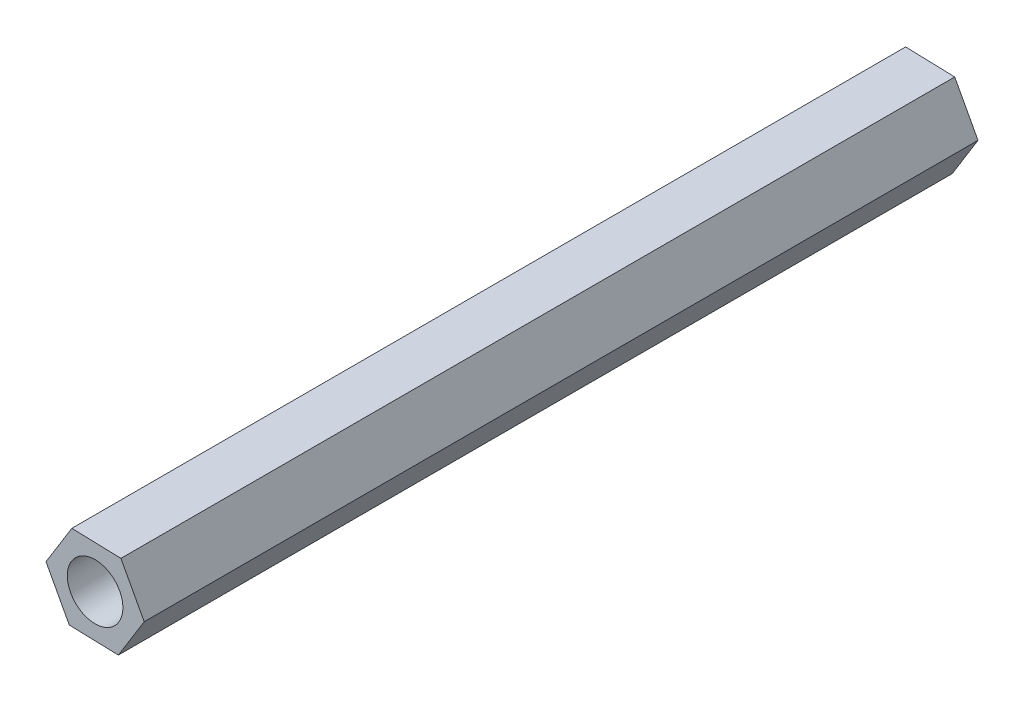
ISO-10303-21;
HEADER;
FILE_DESCRIPTION(('STEP AP214'),'2;1');
FILE_NAME('part.step','',(''),(''),'','','');
FILE_SCHEMA(('AUTOMOTIVE_DESIGN { 1 0 10303 214 1 1 1 1 }'));
ENDSEC;
DATA;
#1=APPLICATION_CONTEXT('core data for automotive mechanical design processes');
#2=APPLICATION_PROTOCOL_DEFINITION('international standard','automotive_design',2000,#1);
#3=PRODUCT_CONTEXT('',#1,'mechanical');
#4=PRODUCT('Part','Part','',(#3));
#5=PRODUCT_RELATED_PRODUCT_CATEGORY('part','',(#4));
#6=PRODUCT_DEFINITION_FORMATION('','',#4);
#7=PRODUCT_DEFINITION_CONTEXT('part definition',#1,'design');
#8=PRODUCT_DEFINITION('design','',#6,#7);
#9=PRODUCT_DEFINITION_SHAPE('','',#8);
#10=(LENGTH_UNIT() NAMED_UNIT(*) SI_UNIT(.MILLI.,.METRE.));
#11=(NAMED_UNIT(*) PLANE_ANGLE_UNIT() SI_UNIT($,.RADIAN.));
#12=(NAMED_UNIT(*) SI_UNIT($,.STERADIAN.) SOLID_ANGLE_UNIT());
#13=UNCERTAINTY_MEASURE_WITH_UNIT(LENGTH_MEASURE(1.E-05),#10,'distance_accuracy_value','');
#14=(GEOMETRIC_REPRESENTATION_CONTEXT(3) GLOBAL_UNCERTAINTY_ASSIGNED_CONTEXT((#13)) GLOBAL_UNIT_ASSIGNED_CONTEXT((#10,
#11,#12)) REPRESENTATION_CONTEXT('',''));
#15=CARTESIAN_POINT('',(0.,0.,0.));
#16=DIRECTION('',(0.,0.,1.));
#17=DIRECTION('',(1.,0.,0.));
#18=AXIS2_PLACEMENT_3D('',#15,#16,#17);
#19=CARTESIAN_POINT('',(0.,0.,45.));
#20=DIRECTION('',(0.,0.,1.));
#21=DIRECTION('',(1.,0.,0.));
#22=AXIS2_PLACEMENT_3D('',#19,#20,#21);
#23=PLANE('',#22);
#24=DIRECTION('',(0.999547968895249,-0.0300642291998806,0.));
#25=VECTOR('',#24,1.);
#26=CARTESIAN_POINT('',(-1.39402762614969,-2.25511420148972,45.));
#27=LINE('',#26,#25);
#28=CARTESIAN_POINT('',(-1.39402762614969,-2.25511420148972,45.));
#29=VERTEX_POINT('',#28);
#30=CARTESIAN_POINT('',(1.25597237385031,-2.33482043856781,45.));
#31=VERTEX_POINT('',#30);
#32=EDGE_CURVE('E129',#29,#31,#27,.T.);
#33=ORIENTED_EDGE('',*,*,#32,.T.);
#34=DIRECTION('',(0.525810370679919,0.850601818764483,0.));
#35=VECTOR('',#34,1.);
#36=CARTESIAN_POINT('',(1.25597237385031,-2.33482043856781,45.));
#37=LINE('',#36,#35);
#38=CARTESIAN_POINT('',(2.65,-0.0797062370780844,45.));
#39=VERTEX_POINT('',#38);
#40=EDGE_CURVE('E87',#31,#39,#37,.T.);
#41=ORIENTED_EDGE('',*,*,#40,.T.);
#42=DIRECTION('',(-0.47373759821533,0.880666047964363,0.));
#43=VECTOR('',#42,1.);
#44=CARTESIAN_POINT('',(2.65,-0.0797062370780844,45.));
#45=LINE('',#44,#43);
#46=CARTESIAN_POINT('',(1.39402762614969,2.25511420148972,45.));
#47=VERTEX_POINT('',#46);
#48=EDGE_CURVE('E100',#39,#47,#45,.T.);
#49=ORIENTED_EDGE('',*,*,#48,.T.);
#50=DIRECTION('',(-0.999547968895249,0.0300642291998806,0.));
#51=VECTOR('',#50,1.);
#52=CARTESIAN_POINT('',(1.39402762614969,2.25511420148972,45.));
#53=LINE('',#52,#51);
#54=CARTESIAN_POINT('',(-1.25597237385031,2.33482043856781,45.));
#55=VERTEX_POINT('',#54);
#56=EDGE_CURVE('E94',#47,#55,#53,.T.);
#57=ORIENTED_EDGE('',*,*,#56,.T.);
#58=DIRECTION('',(-0.525810370679919,-0.850601818764483,0.));
#59=VECTOR('',#58,1.);
#60=CARTESIAN_POINT('',(-1.25597237385031,2.33482043856781,45.));
#61=LINE('',#60,#59);
#62=CARTESIAN_POINT('',(-2.65,0.0797062370780848,45.));
#63=VERTEX_POINT('',#62);
#64=EDGE_CURVE('E98',#55,#63,#61,.T.);
#65=ORIENTED_EDGE('',*,*,#64,.T.);
#66=DIRECTION('',(0.47373759821533,-0.880666047964363,0.));
#67=VECTOR('',#66,1.);
#68=CARTESIAN_POINT('',(-2.65,0.0797062370780848,45.));
#69=LINE('',#68,#67);
#70=EDGE_CURVE('E50',#63,#29,#69,.T.);
#71=ORIENTED_EDGE('',*,*,#70,.T.);
#72=EDGE_LOOP('',(#33,#41,#49,#57,#65,#71));
#73=FACE_BOUND('',#72,.T.);
#74=CARTESIAN_POINT('',(0.,0.,45.));
#75=DIRECTION('',(0.,0.,1.));
#76=DIRECTION('',(1.,0.,0.));
#77=AXIS2_PLACEMENT_3D('',#74,#75,#76);
#78=CIRCLE('',#77,1.5);
#79=CARTESIAN_POINT('',(-1.5,0.,45.));
#80=VERTEX_POINT('',#79);
#81=EDGE_CURVE('E122',#80,#80,#78,.T.);
#82=ORIENTED_EDGE('',*,*,#81,.F.);
#83=EDGE_LOOP('',(#82));
#84=FACE_BOUND('',#83,.T.);
#85=ADVANCED_FACE('F33',(#73,#84),#23,.T.);
#86=CARTESIAN_POINT('',(0.,0.,0.));
#87=DIRECTION('',(0.,0.,1.));
#88=DIRECTION('',(1.,0.,0.));
#89=AXIS2_PLACEMENT_3D('',#86,#87,#88);
#90=PLANE('',#89);
#91=DIRECTION('',(0.999547968895249,-0.0300642291998806,0.));
#92=VECTOR('',#91,1.);
#93=CARTESIAN_POINT('',(-1.39402762614969,-2.25511420148972,0.));
#94=LINE('',#93,#92);
#95=CARTESIAN_POINT('',(-1.39402762614969,-2.25511420148972,0.));
#96=VERTEX_POINT('',#95);
#97=CARTESIAN_POINT('',(1.25597237385031,-2.33482043856781,0.));
#98=VERTEX_POINT('',#97);
#99=EDGE_CURVE('E118',#96,#98,#94,.T.);
#100=ORIENTED_EDGE('',*,*,#99,.F.);
#101=DIRECTION('',(0.47373759821533,-0.880666047964363,0.));
#102=VECTOR('',#101,1.);
#103=CARTESIAN_POINT('',(-2.65,0.0797062370780848,0.));
#104=LINE('',#103,#102);
#105=CARTESIAN_POINT('',(-2.65,0.0797062370780848,0.));
#106=VERTEX_POINT('',#105);
#107=EDGE_CURVE('E79',#106,#96,#104,.T.);
#108=ORIENTED_EDGE('',*,*,#107,.F.);
#109=DIRECTION('',(-0.525810370679919,-0.850601818764483,0.));
#110=VECTOR('',#109,1.);
#111=CARTESIAN_POINT('',(-1.25597237385031,2.33482043856781,0.));
#112=LINE('',#111,#110);
#113=CARTESIAN_POINT('',(-1.25597237385031,2.33482043856781,0.));
#114=VERTEX_POINT('',#113);
#115=EDGE_CURVE('E73',#114,#106,#112,.T.);
#116=ORIENTED_EDGE('',*,*,#115,.F.);
#117=DIRECTION('',(-0.999547968895249,0.0300642291998806,0.));
#118=VECTOR('',#117,1.);
#119=CARTESIAN_POINT('',(1.39402762614969,2.25511420148972,0.));
#120=LINE('',#119,#118);
#121=CARTESIAN_POINT('',(1.39402762614969,2.25511420148972,0.));
#122=VERTEX_POINT('',#121);
#123=EDGE_CURVE('E108',#122,#114,#120,.T.);
#124=ORIENTED_EDGE('',*,*,#123,.F.);
#125=DIRECTION('',(-0.47373759821533,0.880666047964363,0.));
#126=VECTOR('',#125,1.);
#127=CARTESIAN_POINT('',(2.65,-0.0797062370780844,0.));
#128=LINE('',#127,#126);
#129=CARTESIAN_POINT('',(2.65,-0.0797062370780844,0.));
#130=VERTEX_POINT('',#129);
#131=EDGE_CURVE('E124',#130,#122,#128,.T.);
#132=ORIENTED_EDGE('',*,*,#131,.F.);
#133=DIRECTION('',(0.525810370679919,0.850601818764483,0.));
#134=VECTOR('',#133,1.);
#135=CARTESIAN_POINT('',(1.25597237385031,-2.33482043856781,0.));
#136=LINE('',#135,#134);
#137=EDGE_CURVE('E121',#98,#130,#136,.T.);
#138=ORIENTED_EDGE('',*,*,#137,.F.);
#139=EDGE_LOOP('',(#100,#108,#116,#124,#132,#138));
#140=FACE_BOUND('',#139,.T.);
#141=CARTESIAN_POINT('',(0.,0.,0.));
#142=DIRECTION('',(0.,0.,1.));
#143=DIRECTION('',(1.,0.,0.));
#144=AXIS2_PLACEMENT_3D('',#141,#142,#143);
#145=CIRCLE('',#144,1.5);
#146=CARTESIAN_POINT('',(-1.5,0.,0.));
#147=VERTEX_POINT('',#146);
#148=EDGE_CURVE('E222',#147,#147,#145,.T.);
#149=ORIENTED_EDGE('',*,*,#148,.T.);
#150=EDGE_LOOP('',(#149));
#151=FACE_BOUND('',#150,.T.);
#152=ADVANCED_FACE('F138',(#140,#151),#90,.F.);
#153=CARTESIAN_POINT('',(-1.39402762614969,-2.25511420148972,45.));
#154=DIRECTION('',(0.0300642291998806,0.999547968895249,0.));
#155=DIRECTION('',(-0.999547968895249,0.0300642291998806,0.));
#156=AXIS2_PLACEMENT_3D('',#153,#154,#155);
#157=PLANE('',#156);
#158=ORIENTED_EDGE('',*,*,#99,.T.);
#159=DIRECTION('',(0.,0.,-1.));
#160=VECTOR('',#159,1.);
#161=CARTESIAN_POINT('',(1.25597237385031,-2.33482043856781,45.));
#162=LINE('',#161,#160);
#163=EDGE_CURVE('E11',#31,#98,#162,.T.);
#164=ORIENTED_EDGE('',*,*,#163,.F.);
#165=ORIENTED_EDGE('',*,*,#32,.F.);
#166=DIRECTION('',(0.,0.,-1.));
#167=VECTOR('',#166,1.);
#168=CARTESIAN_POINT('',(-1.39402762614969,-2.25511420148972,45.));
#169=LINE('',#168,#167);
#170=EDGE_CURVE('E114',#29,#96,#169,.T.);
#171=ORIENTED_EDGE('',*,*,#170,.T.);
#172=EDGE_LOOP('',(#158,#164,#165,#171));
#173=FACE_BOUND('',#172,.T.);
#174=ADVANCED_FACE('F35',(#173),#157,.F.);
#175=CARTESIAN_POINT('',(1.25597237385031,-2.33482043856781,45.));
#176=DIRECTION('',(-0.850601818764483,0.525810370679918,0.));
#177=DIRECTION('',(-0.525810370679919,-0.850601818764483,0.));
#178=AXIS2_PLACEMENT_3D('',#175,#176,#177);
#179=PLANE('',#178);
#180=ORIENTED_EDGE('',*,*,#137,.T.);
#181=DIRECTION('',(0.,0.,-1.));
#182=VECTOR('',#181,1.);
#183=CARTESIAN_POINT('',(2.65,-0.0797062370780844,45.));
#184=LINE('',#183,#182);
#185=EDGE_CURVE('E42',#39,#130,#184,.T.);
#186=ORIENTED_EDGE('',*,*,#185,.F.);
#187=ORIENTED_EDGE('',*,*,#40,.F.);
#188=ORIENTED_EDGE('',*,*,#163,.T.);
#189=EDGE_LOOP('',(#180,#186,#187,#188));
#190=FACE_BOUND('',#189,.T.);
#191=ADVANCED_FACE('F163',(#190),#179,.F.);
#192=CARTESIAN_POINT('',(2.65,-0.0797062370780844,45.));
#193=DIRECTION('',(-0.880666047964363,-0.47373759821533,0.));
#194=DIRECTION('',(0.47373759821533,-0.880666047964364,0.));
#195=AXIS2_PLACEMENT_3D('',#192,#193,#194);
#196=PLANE('',#195);
#197=ORIENTED_EDGE('',*,*,#131,.T.);
#198=DIRECTION('',(0.,0.,-1.));
#199=VECTOR('',#198,1.);
#200=CARTESIAN_POINT('',(1.39402762614969,2.25511420148972,45.));
#201=LINE('',#200,#199);
#202=EDGE_CURVE('E109',#47,#122,#201,.T.);
#203=ORIENTED_EDGE('',*,*,#202,.F.);
#204=ORIENTED_EDGE('',*,*,#48,.F.);
#205=ORIENTED_EDGE('',*,*,#185,.T.);
#206=EDGE_LOOP('',(#197,#203,#204,#205));
#207=FACE_BOUND('',#206,.T.);
#208=ADVANCED_FACE('F135',(#207),#196,.F.);
#209=CARTESIAN_POINT('',(1.39402762614969,2.25511420148972,45.));
#210=DIRECTION('',(-0.0300642291998806,-0.999547968895249,0.));
#211=DIRECTION('',(0.999547968895249,-0.0300642291998806,0.));
#212=AXIS2_PLACEMENT_3D('',#209,#210,#211);
#213=PLANE('',#212);
#214=ORIENTED_EDGE('',*,*,#123,.T.);
#215=DIRECTION('',(0.,0.,-1.));
#216=VECTOR('',#215,1.);
#217=CARTESIAN_POINT('',(-1.25597237385031,2.33482043856781,45.));
#218=LINE('',#217,#216);
#219=EDGE_CURVE('E105',#55,#114,#218,.T.);
#220=ORIENTED_EDGE('',*,*,#219,.F.);
#221=ORIENTED_EDGE('',*,*,#56,.F.);
#222=ORIENTED_EDGE('',*,*,#202,.T.);
#223=EDGE_LOOP('',(#214,#220,#221,#222));
#224=FACE_BOUND('',#223,.T.);
#225=ADVANCED_FACE('F106',(#224),#213,.F.);
#226=CARTESIAN_POINT('',(-1.25597237385031,2.33482043856781,45.));
#227=DIRECTION('',(0.850601818764483,-0.525810370679918,0.));
#228=DIRECTION('',(0.525810370679919,0.850601818764483,0.));
#229=AXIS2_PLACEMENT_3D('',#226,#227,#228);
#230=PLANE('',#229);
#231=ORIENTED_EDGE('',*,*,#115,.T.);
#232=DIRECTION('',(0.,0.,-1.));
#233=VECTOR('',#232,1.);
#234=CARTESIAN_POINT('',(-2.65,0.0797062370780848,45.));
#235=LINE('',#234,#233);
#236=EDGE_CURVE('E110',#63,#106,#235,.T.);
#237=ORIENTED_EDGE('',*,*,#236,.F.);
#238=ORIENTED_EDGE('',*,*,#64,.F.);
#239=ORIENTED_EDGE('',*,*,#219,.T.);
#240=EDGE_LOOP('',(#231,#237,#238,#239));
#241=FACE_BOUND('',#240,.T.);
#242=ADVANCED_FACE('F112',(#241),#230,.F.);
#243=CARTESIAN_POINT('',(-2.65,0.0797062370780848,45.));
#244=DIRECTION('',(0.880666047964363,0.47373759821533,0.));
#245=DIRECTION('',(-0.47373759821533,0.880666047964363,0.));
#246=AXIS2_PLACEMENT_3D('',#243,#244,#245);
#247=PLANE('',#246);
#248=ORIENTED_EDGE('',*,*,#107,.T.);
#249=ORIENTED_EDGE('',*,*,#170,.F.);
#250=ORIENTED_EDGE('',*,*,#70,.F.);
#251=ORIENTED_EDGE('',*,*,#236,.T.);
#252=EDGE_LOOP('',(#248,#249,#250,#251));
#253=FACE_BOUND('',#252,.T.);
#254=ADVANCED_FACE('F143',(#253),#247,.F.);
#255=CARTESIAN_POINT('',(0.,0.,45.));
#256=DIRECTION('',(0.,0.,-1.));
#257=DIRECTION('',(-1.,0.,0.));
#258=AXIS2_PLACEMENT_3D('',#255,#256,#257);
#259=CYLINDRICAL_SURFACE('',#258,1.5);
#260=CARTESIAN_POINT('',(-1.5,0.,45.));
#261=CARTESIAN_POINT('',(-1.5,0.,44.53125));
#262=CARTESIAN_POINT('',(-1.5,0.,44.0625));
#263=CARTESIAN_POINT('',(-1.5,0.,43.125));
#264=CARTESIAN_POINT('',(-1.5,0.,42.65625));
#265=CARTESIAN_POINT('',(-1.5,0.,41.71875));
#266=CARTESIAN_POINT('',(-1.5,0.,41.25));
#267=CARTESIAN_POINT('',(-1.5,0.,40.3125));
#268=CARTESIAN_POINT('',(-1.5,0.,39.84375));
#269=CARTESIAN_POINT('',(-1.5,0.,38.90625));
#270=CARTESIAN_POINT('',(-1.5,0.,38.4375));
#271=CARTESIAN_POINT('',(-1.5,0.,37.5));
#272=CARTESIAN_POINT('',(-1.5,0.,37.03125));
#273=CARTESIAN_POINT('',(-1.5,0.,36.09375));
#274=CARTESIAN_POINT('',(-1.5,0.,35.625));
#275=CARTESIAN_POINT('',(-1.5,0.,34.6875));
#276=CARTESIAN_POINT('',(-1.5,0.,34.21875));
#277=CARTESIAN_POINT('',(-1.5,0.,33.28125));
#278=CARTESIAN_POINT('',(-1.5,0.,32.8125));
#279=CARTESIAN_POINT('',(-1.5,0.,31.875));
#280=CARTESIAN_POINT('',(-1.5,0.,31.40625));
#281=CARTESIAN_POINT('',(-1.5,0.,30.46875));
#282=CARTESIAN_POINT('',(-1.5,0.,30.));
#283=CARTESIAN_POINT('',(-1.5,0.,29.0625));
#284=CARTESIAN_POINT('',(-1.5,0.,28.59375));
#285=CARTESIAN_POINT('',(-1.5,0.,27.65625));
#286=CARTESIAN_POINT('',(-1.5,0.,27.1875));
#287=CARTESIAN_POINT('',(-1.5,0.,26.25));
#288=CARTESIAN_POINT('',(-1.5,0.,25.78125));
#289=CARTESIAN_POINT('',(-1.5,0.,24.84375));
#290=CARTESIAN_POINT('',(-1.5,0.,24.375));
#291=CARTESIAN_POINT('',(-1.5,0.,23.4375));
#292=CARTESIAN_POINT('',(-1.5,0.,22.96875));
#293=CARTESIAN_POINT('',(-1.5,0.,22.03125));
#294=CARTESIAN_POINT('',(-1.5,0.,21.5625));
#295=CARTESIAN_POINT('',(-1.5,0.,20.625));
#296=CARTESIAN_POINT('',(-1.5,0.,20.15625));
#297=CARTESIAN_POINT('',(-1.5,0.,19.21875));
#298=CARTESIAN_POINT('',(-1.5,0.,18.75));
#299=CARTESIAN_POINT('',(-1.5,0.,17.8125));
#300=CARTESIAN_POINT('',(-1.5,0.,17.34375));
#301=CARTESIAN_POINT('',(-1.5,0.,16.40625));
#302=CARTESIAN_POINT('',(-1.5,0.,15.9375));
#303=CARTESIAN_POINT('',(-1.5,0.,15.));
#304=CARTESIAN_POINT('',(-1.5,0.,14.53125));
#305=CARTESIAN_POINT('',(-1.5,0.,13.59375));
#306=CARTESIAN_POINT('',(-1.5,0.,13.125));
#307=CARTESIAN_POINT('',(-1.5,0.,12.1875));
#308=CARTESIAN_POINT('',(-1.5,0.,11.71875));
#309=CARTESIAN_POINT('',(-1.5,0.,10.78125));
#310=CARTESIAN_POINT('',(-1.5,0.,10.3125));
#311=CARTESIAN_POINT('',(-1.5,0.,9.37499999999999));
#312=CARTESIAN_POINT('',(-1.5,0.,8.90624999999999));
#313=CARTESIAN_POINT('',(-1.5,0.,7.96874999999999));
#314=CARTESIAN_POINT('',(-1.5,0.,7.5));
#315=CARTESIAN_POINT('',(-1.5,0.,6.56249999999999));
#316=CARTESIAN_POINT('',(-1.5,0.,6.09374999999999));
#317=CARTESIAN_POINT('',(-1.5,0.,5.15624999999999));
#318=CARTESIAN_POINT('',(-1.5,0.,4.68749999999999));
#319=CARTESIAN_POINT('',(-1.5,0.,3.74999999999999));
#320=CARTESIAN_POINT('',(-1.5,0.,3.28124999999999));
#321=CARTESIAN_POINT('',(-1.5,0.,2.34374999999999));
#322=CARTESIAN_POINT('',(-1.5,0.,1.87499999999999));
#323=CARTESIAN_POINT('',(-1.5,0.,0.937499999999992));
#324=CARTESIAN_POINT('',(-1.5,0.,0.468749999999993));
#325=CARTESIAN_POINT('',(-1.5,0.,0.));
#326=B_SPLINE_CURVE_WITH_KNOTS('',3,(#260,#261,#262,#263,#264,#265,#266,#267,#268,#269,#270,
#271,#272,#273,#274,#275,#276,#277,#278,#279,#280,#281,#282,#283,#284,#285,#286,#287,#288,#289,
#290,#291,#292,#293,#294,#295,#296,#297,#298,#299,#300,#301,#302,#303,#304,#305,#306,#307,#308,
#309,#310,#311,#312,#313,#314,#315,#316,#317,#318,#319,#320,#321,#322,#323,#324,#325),
.UNSPECIFIED.,.F.,.F.,(4,2,2,2,2,2,2,2,2,2,2,2,2,2,2,2,2,2,2,2,2,2,2,2,2,2,2,2,2,2,2,2,4),(0.,
1.40625,2.8125,4.21874999999999,5.625,7.03125,8.43749999999999,9.84375,11.25,12.65625,14.0625,
15.46875,16.875,18.28125,19.6875,21.09375,22.5,23.90625,25.3125,26.71875,28.125,29.53125,
30.9375,32.34375,33.75,35.15625,36.5625,37.96875,39.375,40.78125,42.1875,43.59375,45.),.UNSPECIFIED.);
#327=EDGE_CURVE('BSEAM145',#80,#147,#326,.T.);
#328=ORIENTED_EDGE('',*,*,#81,.T.);
#329=ORIENTED_EDGE('',*,*,#148,.F.);
#330=ORIENTED_EDGE('',*,*,#327,.T.);
#331=ORIENTED_EDGE('',*,*,#327,.F.);
#332=EDGE_LOOP('',(#328,#330,#329,#331));
#333=FACE_BOUND('',#332,.T.);
#334=ADVANCED_FACE('F145',(#333),#259,.F.);
#335=CLOSED_SHELL('',(#85,#152,#174,#191,#208,#225,#242,#254,#334));
#336=MANIFOLD_SOLID_BREP('B2',#335);
#337=ADVANCED_BREP_SHAPE_REPRESENTATION('',(#18,#336),#14);
#338=SHAPE_DEFINITION_REPRESENTATION(#9,#337);
ENDSEC;
END-ISO-10303-21;
